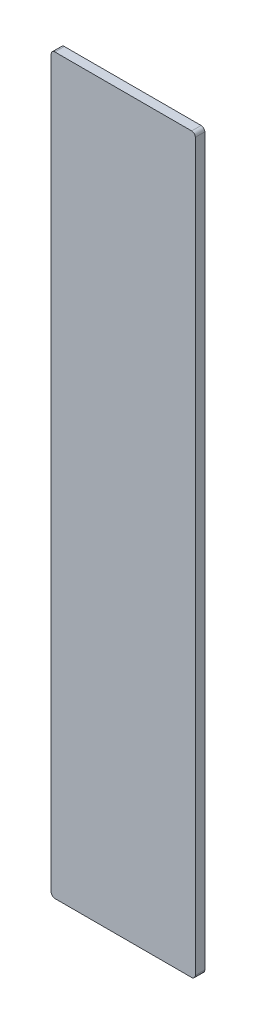
ISO-10303-21;
HEADER;
FILE_DESCRIPTION(('STEP AP214'),'2;1');
FILE_NAME('part.step','',(''),(''),'','','');
FILE_SCHEMA(('AUTOMOTIVE_DESIGN { 1 0 10303 214 1 1 1 1 }'));
ENDSEC;
DATA;
#1=APPLICATION_CONTEXT('core data for automotive mechanical design processes');
#2=APPLICATION_PROTOCOL_DEFINITION('international standard','automotive_design',2000,#1);
#3=PRODUCT_CONTEXT('',#1,'mechanical');
#4=PRODUCT('Part','Part','',(#3));
#5=PRODUCT_RELATED_PRODUCT_CATEGORY('part','',(#4));
#6=PRODUCT_DEFINITION_FORMATION('','',#4);
#7=PRODUCT_DEFINITION_CONTEXT('part definition',#1,'design');
#8=PRODUCT_DEFINITION('design','',#6,#7);
#9=PRODUCT_DEFINITION_SHAPE('','',#8);
#10=(LENGTH_UNIT() NAMED_UNIT(*) SI_UNIT(.MILLI.,.METRE.));
#11=(NAMED_UNIT(*) PLANE_ANGLE_UNIT() SI_UNIT($,.RADIAN.));
#12=(NAMED_UNIT(*) SI_UNIT($,.STERADIAN.) SOLID_ANGLE_UNIT());
#13=UNCERTAINTY_MEASURE_WITH_UNIT(LENGTH_MEASURE(1.E-05),#10,'distance_accuracy_value','');
#14=(GEOMETRIC_REPRESENTATION_CONTEXT(3) GLOBAL_UNCERTAINTY_ASSIGNED_CONTEXT((#13)) GLOBAL_UNIT_ASSIGNED_CONTEXT((#10,
#11,#12)) REPRESENTATION_CONTEXT('',''));
#15=CARTESIAN_POINT('',(0.,0.,0.));
#16=DIRECTION('',(0.,0.,1.));
#17=DIRECTION('',(1.,0.,0.));
#18=AXIS2_PLACEMENT_3D('',#15,#16,#17);
#19=CARTESIAN_POINT('',(355.,30.0000000000002,62.2691453664121));
#20=DIRECTION('',(0.,0.,-1.));
#21=DIRECTION('',(-1.,0.,0.));
#22=AXIS2_PLACEMENT_3D('',#19,#20,#21);
#23=CYLINDRICAL_SURFACE('',#22,3.5);
#24=CARTESIAN_POINT('',(355.,30.0000000000002,53.269145366412));
#25=DIRECTION('',(0.,0.,1.));
#26=DIRECTION('',(1.,0.,0.));
#27=AXIS2_PLACEMENT_3D('',#24,#25,#26);
#28=CIRCLE('',#27,3.5);
#29=CARTESIAN_POINT('',(351.5,30.0000000000002,53.269145366412));
#30=VERTEX_POINT('',#29);
#31=CARTESIAN_POINT('',(355.,26.5000000000002,53.269145366412));
#32=VERTEX_POINT('',#31);
#33=EDGE_CURVE('E135',#30,#32,#28,.T.);
#34=ORIENTED_EDGE('',*,*,#33,.T.);
#35=DIRECTION('',(0.,0.,-1.));
#36=VECTOR('',#35,1.);
#37=CARTESIAN_POINT('',(355.,26.5000000000002,62.2691453664121));
#38=LINE('',#37,#36);
#39=CARTESIAN_POINT('',(355.,26.5000000000002,62.2691453664121));
#40=VERTEX_POINT('',#39);
#41=EDGE_CURVE('E11',#40,#32,#38,.T.);
#42=ORIENTED_EDGE('',*,*,#41,.F.);
#43=CARTESIAN_POINT('',(355.,30.0000000000002,62.2691453664121));
#44=DIRECTION('',(0.,0.,1.));
#45=DIRECTION('',(1.,0.,0.));
#46=AXIS2_PLACEMENT_3D('',#43,#44,#45);
#47=CIRCLE('',#46,3.5);
#48=CARTESIAN_POINT('',(351.5,30.0000000000002,62.2691453664121));
#49=VERTEX_POINT('',#48);
#50=EDGE_CURVE('E149',#49,#40,#47,.T.);
#51=ORIENTED_EDGE('',*,*,#50,.F.);
#52=DIRECTION('',(0.,0.,-1.));
#53=VECTOR('',#52,1.);
#54=CARTESIAN_POINT('',(351.5,30.0000000000002,62.2691453664121));
#55=LINE('',#54,#53);
#56=EDGE_CURVE('E131',#49,#30,#55,.T.);
#57=ORIENTED_EDGE('',*,*,#56,.T.);
#58=EDGE_LOOP('',(#34,#42,#51,#57));
#59=FACE_BOUND('',#58,.T.);
#60=ADVANCED_FACE('F39',(#59),#23,.T.);
#61=CARTESIAN_POINT('',(355.,26.5000000000002,62.2691453664121));
#62=DIRECTION('',(0.,1.,0.));
#63=DIRECTION('',(-1.,0.,0.));
#64=AXIS2_PLACEMENT_3D('',#61,#62,#63);
#65=PLANE('',#64);
#66=DIRECTION('',(1.,0.,0.));
#67=VECTOR('',#66,1.);
#68=CARTESIAN_POINT('',(355.,26.5000000000002,53.269145366412));
#69=LINE('',#68,#67);
#70=CARTESIAN_POINT('',(485.000000000006,26.5000000000002,53.269145366412));
#71=VERTEX_POINT('',#70);
#72=EDGE_CURVE('E138',#32,#71,#69,.T.);
#73=ORIENTED_EDGE('',*,*,#72,.T.);
#74=DIRECTION('',(0.,0.,-1.));
#75=VECTOR('',#74,1.);
#76=CARTESIAN_POINT('',(485.000000000006,26.5000000000002,62.2691453664121));
#77=LINE('',#76,#75);
#78=CARTESIAN_POINT('',(485.000000000006,26.5000000000002,62.2691453664121));
#79=VERTEX_POINT('',#78);
#80=EDGE_CURVE('E47',#79,#71,#77,.T.);
#81=ORIENTED_EDGE('',*,*,#80,.F.);
#82=DIRECTION('',(1.,0.,0.));
#83=VECTOR('',#82,1.);
#84=CARTESIAN_POINT('',(355.,26.5000000000002,62.2691453664121));
#85=LINE('',#84,#83);
#86=EDGE_CURVE('E98',#40,#79,#85,.T.);
#87=ORIENTED_EDGE('',*,*,#86,.F.);
#88=ORIENTED_EDGE('',*,*,#41,.T.);
#89=EDGE_LOOP('',(#73,#81,#87,#88));
#90=FACE_BOUND('',#89,.T.);
#91=ADVANCED_FACE('F184',(#90),#65,.F.);
#92=CARTESIAN_POINT('',(485.000000000006,30.0000000000002,62.2691453664121));
#93=DIRECTION('',(0.,0.,-1.));
#94=DIRECTION('',(-1.,0.,0.));
#95=AXIS2_PLACEMENT_3D('',#92,#93,#94);
#96=CYLINDRICAL_SURFACE('',#95,3.5);
#97=CARTESIAN_POINT('',(485.000000000006,30.0000000000002,53.269145366412));
#98=DIRECTION('',(0.,0.,1.));
#99=DIRECTION('',(1.,0.,0.));
#100=AXIS2_PLACEMENT_3D('',#97,#98,#99);
#101=CIRCLE('',#100,3.5);
#102=CARTESIAN_POINT('',(488.500000000006,30.0000000000002,53.269145366412));
#103=VERTEX_POINT('',#102);
#104=EDGE_CURVE('E140',#71,#103,#101,.T.);
#105=ORIENTED_EDGE('',*,*,#104,.T.);
#106=DIRECTION('',(0.,0.,-1.));
#107=VECTOR('',#106,1.);
#108=CARTESIAN_POINT('',(488.500000000006,30.0000000000002,62.2691453664121));
#109=LINE('',#108,#107);
#110=CARTESIAN_POINT('',(488.500000000006,30.0000000000002,62.2691453664121));
#111=VERTEX_POINT('',#110);
#112=EDGE_CURVE('E156',#111,#103,#109,.T.);
#113=ORIENTED_EDGE('',*,*,#112,.F.);
#114=CARTESIAN_POINT('',(485.000000000006,30.0000000000002,62.2691453664121));
#115=DIRECTION('',(0.,0.,1.));
#116=DIRECTION('',(1.,0.,0.));
#117=AXIS2_PLACEMENT_3D('',#114,#115,#116);
#118=CIRCLE('',#117,3.5);
#119=EDGE_CURVE('E164',#79,#111,#118,.T.);
#120=ORIENTED_EDGE('',*,*,#119,.F.);
#121=ORIENTED_EDGE('',*,*,#80,.T.);
#122=EDGE_LOOP('',(#105,#113,#120,#121));
#123=FACE_BOUND('',#122,.T.);
#124=ADVANCED_FACE('F162',(#123),#96,.T.);
#125=CARTESIAN_POINT('',(488.500000000006,30.0000000000002,62.2691453664121));
#126=DIRECTION('',(-1.,0.,0.));
#127=DIRECTION('',(0.,0.,1.));
#128=AXIS2_PLACEMENT_3D('',#125,#126,#127);
#129=PLANE('',#128);
#130=DIRECTION('',(0.,1.,0.));
#131=VECTOR('',#130,1.);
#132=CARTESIAN_POINT('',(488.500000000006,30.0000000000002,53.269145366412));
#133=LINE('',#132,#131);
#134=CARTESIAN_POINT('',(488.500000000006,720.,53.269145366412));
#135=VERTEX_POINT('',#134);
#136=EDGE_CURVE('E142',#103,#135,#133,.T.);
#137=ORIENTED_EDGE('',*,*,#136,.T.);
#138=DIRECTION('',(0.,0.,-1.));
#139=VECTOR('',#138,1.);
#140=CARTESIAN_POINT('',(488.500000000006,720.,62.2691453664121));
#141=LINE('',#140,#139);
#142=CARTESIAN_POINT('',(488.500000000006,720.,62.2691453664121));
#143=VERTEX_POINT('',#142);
#144=EDGE_CURVE('E153',#143,#135,#141,.T.);
#145=ORIENTED_EDGE('',*,*,#144,.F.);
#146=DIRECTION('',(0.,1.,0.));
#147=VECTOR('',#146,1.);
#148=CARTESIAN_POINT('',(488.500000000006,30.0000000000002,62.2691453664121));
#149=LINE('',#148,#147);
#150=EDGE_CURVE('E176',#111,#143,#149,.T.);
#151=ORIENTED_EDGE('',*,*,#150,.F.);
#152=ORIENTED_EDGE('',*,*,#112,.T.);
#153=EDGE_LOOP('',(#137,#145,#151,#152));
#154=FACE_BOUND('',#153,.T.);
#155=ADVANCED_FACE('F172',(#154),#129,.F.);
#156=CARTESIAN_POINT('',(485.000000000006,720.,62.2691453664121));
#157=DIRECTION('',(0.,0.,-1.));
#158=DIRECTION('',(-1.,0.,0.));
#159=AXIS2_PLACEMENT_3D('',#156,#157,#158);
#160=CYLINDRICAL_SURFACE('',#159,3.50000000000003);
#161=CARTESIAN_POINT('',(485.000000000006,720.,53.269145366412));
#162=DIRECTION('',(0.,0.,1.));
#163=DIRECTION('',(1.,0.,0.));
#164=AXIS2_PLACEMENT_3D('',#161,#162,#163);
#165=CIRCLE('',#164,3.50000000000003);
#166=CARTESIAN_POINT('',(485.000000000006,723.5,53.269145366412));
#167=VERTEX_POINT('',#166);
#168=EDGE_CURVE('E144',#135,#167,#165,.T.);
#169=ORIENTED_EDGE('',*,*,#168,.T.);
#170=DIRECTION('',(0.,0.,-1.));
#171=VECTOR('',#170,1.);
#172=CARTESIAN_POINT('',(485.000000000006,723.5,62.2691453664121));
#173=LINE('',#172,#171);
#174=CARTESIAN_POINT('',(485.000000000006,723.5,62.2691453664121));
#175=VERTEX_POINT('',#174);
#176=EDGE_CURVE('E126',#175,#167,#173,.T.);
#177=ORIENTED_EDGE('',*,*,#176,.F.);
#178=CARTESIAN_POINT('',(485.000000000006,720.,62.2691453664121));
#179=DIRECTION('',(0.,0.,1.));
#180=DIRECTION('',(1.,0.,0.));
#181=AXIS2_PLACEMENT_3D('',#178,#179,#180);
#182=CIRCLE('',#181,3.50000000000003);
#183=EDGE_CURVE('E117',#143,#175,#182,.T.);
#184=ORIENTED_EDGE('',*,*,#183,.F.);
#185=ORIENTED_EDGE('',*,*,#144,.T.);
#186=EDGE_LOOP('',(#169,#177,#184,#185));
#187=FACE_BOUND('',#186,.T.);
#188=ADVANCED_FACE('F175',(#187),#160,.T.);
#189=CARTESIAN_POINT('',(485.000000000006,723.5,62.2691453664121));
#190=DIRECTION('',(0.,-1.,0.));
#191=DIRECTION('',(0.,0.,-1.));
#192=AXIS2_PLACEMENT_3D('',#189,#190,#191);
#193=PLANE('',#192);
#194=DIRECTION('',(-1.,0.,0.));
#195=VECTOR('',#194,1.);
#196=CARTESIAN_POINT('',(485.000000000006,723.5,53.269145366412));
#197=LINE('',#196,#195);
#198=CARTESIAN_POINT('',(355.,723.5,53.269145366412));
#199=VERTEX_POINT('',#198);
#200=EDGE_CURVE('E125',#167,#199,#197,.T.);
#201=ORIENTED_EDGE('',*,*,#200,.T.);
#202=DIRECTION('',(0.,0.,-1.));
#203=VECTOR('',#202,1.);
#204=CARTESIAN_POINT('',(355.,723.5,62.2691453664121));
#205=LINE('',#204,#203);
#206=CARTESIAN_POINT('',(355.,723.5,62.2691453664121));
#207=VERTEX_POINT('',#206);
#208=EDGE_CURVE('E122',#207,#199,#205,.T.);
#209=ORIENTED_EDGE('',*,*,#208,.F.);
#210=DIRECTION('',(-1.,0.,0.));
#211=VECTOR('',#210,1.);
#212=CARTESIAN_POINT('',(485.000000000006,723.5,62.2691453664121));
#213=LINE('',#212,#211);
#214=EDGE_CURVE('E111',#175,#207,#213,.T.);
#215=ORIENTED_EDGE('',*,*,#214,.F.);
#216=ORIENTED_EDGE('',*,*,#176,.T.);
#217=EDGE_LOOP('',(#201,#209,#215,#216));
#218=FACE_BOUND('',#217,.T.);
#219=ADVANCED_FACE('F123',(#218),#193,.F.);
#220=CARTESIAN_POINT('',(355.,720.,62.2691453664121));
#221=DIRECTION('',(0.,0.,-1.));
#222=DIRECTION('',(-1.,0.,0.));
#223=AXIS2_PLACEMENT_3D('',#220,#221,#222);
#224=CYLINDRICAL_SURFACE('',#223,3.50000000000003);
#225=CARTESIAN_POINT('',(355.,720.,53.269145366412));
#226=DIRECTION('',(0.,0.,1.));
#227=DIRECTION('',(1.,0.,0.));
#228=AXIS2_PLACEMENT_3D('',#225,#226,#227);
#229=CIRCLE('',#228,3.50000000000003);
#230=CARTESIAN_POINT('',(351.5,720.,53.269145366412));
#231=VERTEX_POINT('',#230);
#232=EDGE_CURVE('E84',#199,#231,#229,.T.);
#233=ORIENTED_EDGE('',*,*,#232,.T.);
#234=DIRECTION('',(0.,0.,-1.));
#235=VECTOR('',#234,1.);
#236=CARTESIAN_POINT('',(351.5,720.,62.2691453664121));
#237=LINE('',#236,#235);
#238=CARTESIAN_POINT('',(351.5,720.,62.2691453664121));
#239=VERTEX_POINT('',#238);
#240=EDGE_CURVE('E127',#239,#231,#237,.T.);
#241=ORIENTED_EDGE('',*,*,#240,.F.);
#242=CARTESIAN_POINT('',(355.,720.,62.2691453664121));
#243=DIRECTION('',(0.,0.,1.));
#244=DIRECTION('',(1.,0.,0.));
#245=AXIS2_PLACEMENT_3D('',#242,#243,#244);
#246=CIRCLE('',#245,3.50000000000003);
#247=EDGE_CURVE('E115',#207,#239,#246,.T.);
#248=ORIENTED_EDGE('',*,*,#247,.F.);
#249=ORIENTED_EDGE('',*,*,#208,.T.);
#250=EDGE_LOOP('',(#233,#241,#248,#249));
#251=FACE_BOUND('',#250,.T.);
#252=ADVANCED_FACE('F129',(#251),#224,.T.);
#253=CARTESIAN_POINT('',(351.5,720.,62.2691453664121));
#254=DIRECTION('',(1.,0.,0.));
#255=DIRECTION('',(0.,1.,0.));
#256=AXIS2_PLACEMENT_3D('',#253,#254,#255);
#257=PLANE('',#256);
#258=DIRECTION('',(0.,-1.,0.));
#259=VECTOR('',#258,1.);
#260=CARTESIAN_POINT('',(351.5,720.,53.269145366412));
#261=LINE('',#260,#259);
#262=EDGE_CURVE('E90',#231,#30,#261,.T.);
#263=ORIENTED_EDGE('',*,*,#262,.T.);
#264=ORIENTED_EDGE('',*,*,#56,.F.);
#265=DIRECTION('',(0.,-1.,0.));
#266=VECTOR('',#265,1.);
#267=CARTESIAN_POINT('',(351.5,720.,62.2691453664121));
#268=LINE('',#267,#266);
#269=EDGE_CURVE('E55',#239,#49,#268,.T.);
#270=ORIENTED_EDGE('',*,*,#269,.F.);
#271=ORIENTED_EDGE('',*,*,#240,.T.);
#272=EDGE_LOOP('',(#263,#264,#270,#271));
#273=FACE_BOUND('',#272,.T.);
#274=ADVANCED_FACE('F200',(#273),#257,.F.);
#275=CARTESIAN_POINT('',(355.,30.0000000000002,62.2691453664121));
#276=DIRECTION('',(0.,0.,1.));
#277=DIRECTION('',(1.,0.,0.));
#278=AXIS2_PLACEMENT_3D('',#275,#276,#277);
#279=PLANE('',#278);
#280=ORIENTED_EDGE('',*,*,#50,.T.);
#281=ORIENTED_EDGE('',*,*,#86,.T.);
#282=ORIENTED_EDGE('',*,*,#119,.T.);
#283=ORIENTED_EDGE('',*,*,#150,.T.);
#284=ORIENTED_EDGE('',*,*,#183,.T.);
#285=ORIENTED_EDGE('',*,*,#214,.T.);
#286=ORIENTED_EDGE('',*,*,#247,.T.);
#287=ORIENTED_EDGE('',*,*,#269,.T.);
#288=EDGE_LOOP('',(#280,#281,#282,#283,#284,#285,#286,#287));
#289=FACE_BOUND('',#288,.T.);
#290=ADVANCED_FACE('F113',(#289),#279,.T.);
#291=CARTESIAN_POINT('',(355.,30.0000000000002,53.269145366412));
#292=DIRECTION('',(0.,0.,1.));
#293=DIRECTION('',(1.,0.,0.));
#294=AXIS2_PLACEMENT_3D('',#291,#292,#293);
#295=PLANE('',#294);
#296=ORIENTED_EDGE('',*,*,#33,.F.);
#297=ORIENTED_EDGE('',*,*,#262,.F.);
#298=ORIENTED_EDGE('',*,*,#232,.F.);
#299=ORIENTED_EDGE('',*,*,#200,.F.);
#300=ORIENTED_EDGE('',*,*,#168,.F.);
#301=ORIENTED_EDGE('',*,*,#136,.F.);
#302=ORIENTED_EDGE('',*,*,#104,.F.);
#303=ORIENTED_EDGE('',*,*,#72,.F.);
#304=EDGE_LOOP('',(#296,#297,#298,#299,#300,#301,#302,#303));
#305=FACE_BOUND('',#304,.T.);
#306=ADVANCED_FACE('F168',(#305),#295,.F.);
#307=CLOSED_SHELL('',(#60,#91,#124,#155,#188,#219,#252,#274,#290,#306));
#308=MANIFOLD_SOLID_BREP('B2',#307);
#309=ADVANCED_BREP_SHAPE_REPRESENTATION('',(#18,#308),#14);
#310=SHAPE_DEFINITION_REPRESENTATION(#9,#309);
ENDSEC;
END-ISO-10303-21;
